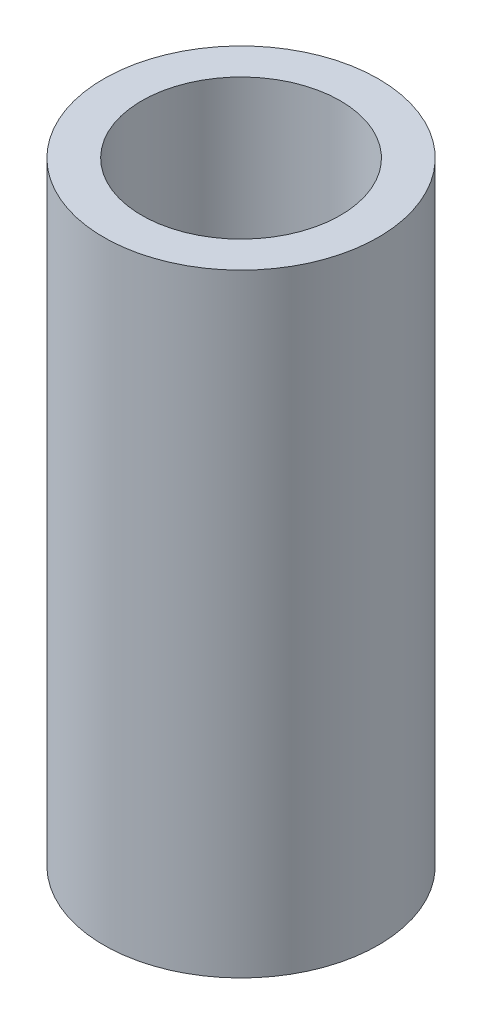
ISO-10303-21;
HEADER;
FILE_DESCRIPTION(('STEP AP214'),'2;1');
FILE_NAME('part.step','',(''),(''),'','','');
FILE_SCHEMA(('AUTOMOTIVE_DESIGN { 1 0 10303 214 1 1 1 1 }'));
ENDSEC;
DATA;
#1=APPLICATION_CONTEXT('core data for automotive mechanical design processes');
#2=APPLICATION_PROTOCOL_DEFINITION('international standard','automotive_design',2000,#1);
#3=PRODUCT_CONTEXT('',#1,'mechanical');
#4=PRODUCT('Part','Part','',(#3));
#5=PRODUCT_RELATED_PRODUCT_CATEGORY('part','',(#4));
#6=PRODUCT_DEFINITION_FORMATION('','',#4);
#7=PRODUCT_DEFINITION_CONTEXT('part definition',#1,'design');
#8=PRODUCT_DEFINITION('design','',#6,#7);
#9=PRODUCT_DEFINITION_SHAPE('','',#8);
#10=(LENGTH_UNIT() NAMED_UNIT(*) SI_UNIT(.MILLI.,.METRE.));
#11=(NAMED_UNIT(*) PLANE_ANGLE_UNIT() SI_UNIT($,.RADIAN.));
#12=(NAMED_UNIT(*) SI_UNIT($,.STERADIAN.) SOLID_ANGLE_UNIT());
#13=UNCERTAINTY_MEASURE_WITH_UNIT(LENGTH_MEASURE(1.E-05),#10,'distance_accuracy_value','');
#14=(GEOMETRIC_REPRESENTATION_CONTEXT(3) GLOBAL_UNCERTAINTY_ASSIGNED_CONTEXT((#13)) GLOBAL_UNIT_ASSIGNED_CONTEXT((#10,
#11,#12)) REPRESENTATION_CONTEXT('',''));
#15=CARTESIAN_POINT('',(0.,0.,0.));
#16=DIRECTION('',(0.,0.,1.));
#17=DIRECTION('',(1.,0.,0.));
#18=AXIS2_PLACEMENT_3D('',#15,#16,#17);
#19=CARTESIAN_POINT('',(0.,0.,0.));
#20=DIRECTION('',(0.,-1.,0.));
#21=DIRECTION('',(0.,0.,-1.));
#22=AXIS2_PLACEMENT_3D('',#19,#20,#21);
#23=CYLINDRICAL_SURFACE('',#22,4.05);
#24=CARTESIAN_POINT('',(0.,0.,0.));
#25=DIRECTION('',(0.,-1.,0.));
#26=DIRECTION('',(0.,0.,-1.));
#27=AXIS2_PLACEMENT_3D('',#24,#25,#26);
#28=CIRCLE('',#27,4.05);
#29=CARTESIAN_POINT('',(0.,0.,-4.05));
#30=VERTEX_POINT('',#29);
#31=EDGE_CURVE('E60',#30,#30,#28,.T.);
#32=ORIENTED_EDGE('',*,*,#31,.T.);
#33=EDGE_LOOP('',(#32));
#34=FACE_BOUND('',#33,.T.);
#35=CARTESIAN_POINT('',(0.,25.,0.));
#36=DIRECTION('',(0.,-1.,0.));
#37=DIRECTION('',(0.,0.,-1.));
#38=AXIS2_PLACEMENT_3D('',#35,#36,#37);
#39=CIRCLE('',#38,4.05);
#40=CARTESIAN_POINT('',(0.,25.,-4.05));
#41=VERTEX_POINT('',#40);
#42=EDGE_CURVE('E10',#41,#41,#39,.T.);
#43=ORIENTED_EDGE('',*,*,#42,.F.);
#44=EDGE_LOOP('',(#43));
#45=FACE_BOUND('',#44,.T.);
#46=ADVANCED_FACE('F41',(#34,#45),#23,.F.);
#47=CARTESIAN_POINT('',(4.05,25.,0.));
#48=DIRECTION('',(0.,1.,0.));
#49=DIRECTION('',(0.,0.,1.));
#50=AXIS2_PLACEMENT_3D('',#47,#48,#49);
#51=PLANE('',#50);
#52=ORIENTED_EDGE('',*,*,#42,.T.);
#53=EDGE_LOOP('',(#52));
#54=FACE_BOUND('',#53,.T.);
#55=CARTESIAN_POINT('',(0.,25.,0.));
#56=DIRECTION('',(0.,-1.,0.));
#57=DIRECTION('',(0.,0.,-1.));
#58=AXIS2_PLACEMENT_3D('',#55,#56,#57);
#59=CIRCLE('',#58,5.6);
#60=CARTESIAN_POINT('',(0.,25.,-5.6));
#61=VERTEX_POINT('',#60);
#62=EDGE_CURVE('E48',#61,#61,#59,.T.);
#63=ORIENTED_EDGE('',*,*,#62,.F.);
#64=EDGE_LOOP('',(#63));
#65=FACE_BOUND('',#64,.T.);
#66=ADVANCED_FACE('F74',(#54,#65),#51,.T.);
#67=CARTESIAN_POINT('',(0.,0.,0.));
#68=DIRECTION('',(0.,-1.,0.));
#69=DIRECTION('',(0.,0.,-1.));
#70=AXIS2_PLACEMENT_3D('',#67,#68,#69);
#71=CYLINDRICAL_SURFACE('',#70,5.6);
#72=ORIENTED_EDGE('',*,*,#62,.T.);
#73=EDGE_LOOP('',(#72));
#74=FACE_BOUND('',#73,.T.);
#75=CARTESIAN_POINT('',(0.,0.,0.));
#76=DIRECTION('',(0.,-1.,0.));
#77=DIRECTION('',(0.,0.,-1.));
#78=AXIS2_PLACEMENT_3D('',#75,#76,#77);
#79=CIRCLE('',#78,5.6);
#80=CARTESIAN_POINT('',(0.,0.,-5.6));
#81=VERTEX_POINT('',#80);
#82=EDGE_CURVE('E52',#81,#81,#79,.T.);
#83=ORIENTED_EDGE('',*,*,#82,.F.);
#84=EDGE_LOOP('',(#83));
#85=FACE_BOUND('',#84,.T.);
#86=ADVANCED_FACE('F70',(#74,#85),#71,.T.);
#87=CARTESIAN_POINT('',(4.05,0.,0.));
#88=DIRECTION('',(0.,-1.,0.));
#89=DIRECTION('',(0.,0.,-1.));
#90=AXIS2_PLACEMENT_3D('',#87,#88,#89);
#91=PLANE('',#90);
#92=ORIENTED_EDGE('',*,*,#82,.T.);
#93=EDGE_LOOP('',(#92));
#94=FACE_BOUND('',#93,.T.);
#95=ORIENTED_EDGE('',*,*,#31,.F.);
#96=EDGE_LOOP('',(#95));
#97=FACE_BOUND('',#96,.T.);
#98=ADVANCED_FACE('F62',(#94,#97),#91,.T.);
#99=CLOSED_SHELL('',(#46,#66,#86,#98));
#100=MANIFOLD_SOLID_BREP('B2',#99);
#101=ADVANCED_BREP_SHAPE_REPRESENTATION('',(#18,#100),#14);
#102=SHAPE_DEFINITION_REPRESENTATION(#9,#101);
ENDSEC;
END-ISO-10303-21;
